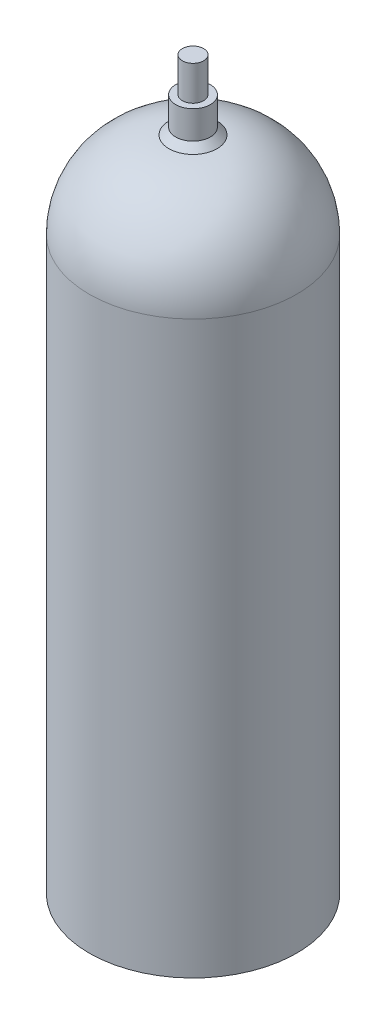
ISO-10303-21;
HEADER;
FILE_DESCRIPTION(('STEP AP214'),'2;1');
FILE_NAME('part.step','',(''),(''),'','','');
FILE_SCHEMA(('AUTOMOTIVE_DESIGN { 1 0 10303 214 1 1 1 1 }'));
ENDSEC;
DATA;
#1=APPLICATION_CONTEXT('core data for automotive mechanical design processes');
#2=APPLICATION_PROTOCOL_DEFINITION('international standard','automotive_design',2000,#1);
#3=PRODUCT_CONTEXT('',#1,'mechanical');
#4=PRODUCT('Part','Part','',(#3));
#5=PRODUCT_RELATED_PRODUCT_CATEGORY('part','',(#4));
#6=PRODUCT_DEFINITION_FORMATION('','',#4);
#7=PRODUCT_DEFINITION_CONTEXT('part definition',#1,'design');
#8=PRODUCT_DEFINITION('design','',#6,#7);
#9=PRODUCT_DEFINITION_SHAPE('','',#8);
#10=(LENGTH_UNIT() NAMED_UNIT(*) SI_UNIT(.MILLI.,.METRE.));
#11=(NAMED_UNIT(*) PLANE_ANGLE_UNIT() SI_UNIT($,.RADIAN.));
#12=(NAMED_UNIT(*) SI_UNIT($,.STERADIAN.) SOLID_ANGLE_UNIT());
#13=UNCERTAINTY_MEASURE_WITH_UNIT(LENGTH_MEASURE(1.E-05),#10,'distance_accuracy_value','');
#14=(GEOMETRIC_REPRESENTATION_CONTEXT(3) GLOBAL_UNCERTAINTY_ASSIGNED_CONTEXT((#13)) GLOBAL_UNIT_ASSIGNED_CONTEXT((#10,
#11,#12)) REPRESENTATION_CONTEXT('',''));
#15=CARTESIAN_POINT('',(0.,0.,0.));
#16=DIRECTION('',(0.,0.,1.));
#17=DIRECTION('',(1.,0.,0.));
#18=AXIS2_PLACEMENT_3D('',#15,#16,#17);
#19=CARTESIAN_POINT('',(0.,337.108439077539,0.));
#20=DIRECTION('',(0.,1.,0.));
#21=DIRECTION('',(0.,0.,1.));
#22=AXIS2_PLACEMENT_3D('',#19,#20,#21);
#23=CYLINDRICAL_SURFACE('',#22,6.34999999999998);
#24=CARTESIAN_POINT('',(0.,225.369026297821,0.));
#25=DIRECTION('',(0.,-1.,0.));
#26=DIRECTION('',(0.,0.,-1.));
#27=AXIS2_PLACEMENT_3D('',#24,#25,#26);
#28=CIRCLE('',#27,6.34999999999998);
#29=CARTESIAN_POINT('',(0.,225.369026297821,-6.34999999999998));
#30=VERTEX_POINT('',#29);
#31=EDGE_CURVE('E54',#30,#30,#28,.F.);
#32=ORIENTED_EDGE('',*,*,#31,.T.);
#33=EDGE_LOOP('',(#32));
#34=FACE_BOUND('',#33,.T.);
#35=CARTESIAN_POINT('',(0.,235.689026297821,0.));
#36=DIRECTION('',(0.,1.,0.));
#37=DIRECTION('',(0.,0.,1.));
#38=AXIS2_PLACEMENT_3D('',#35,#36,#37);
#39=CIRCLE('',#38,6.34999999999998);
#40=CARTESIAN_POINT('',(0.,235.689026297821,6.34999999999998));
#41=VERTEX_POINT('',#40);
#42=EDGE_CURVE('E70',#41,#41,#39,.T.);
#43=ORIENTED_EDGE('',*,*,#42,.F.);
#44=EDGE_LOOP('',(#43));
#45=FACE_BOUND('',#44,.T.);
#46=ADVANCED_FACE('F45',(#34,#45),#23,.T.);
#47=CARTESIAN_POINT('',(38.1,-18.3109737021787,0.));
#48=DIRECTION('',(0.,1.,0.));
#49=DIRECTION('',(0.,0.,1.));
#50=AXIS2_PLACEMENT_3D('',#47,#48,#49);
#51=PLANE('',#50);
#52=CARTESIAN_POINT('',(0.,-18.3109737021788,0.));
#53=DIRECTION('',(0.,1.,0.));
#54=DIRECTION('',(0.,0.,1.));
#55=AXIS2_PLACEMENT_3D('',#52,#53,#54);
#56=CIRCLE('',#55,38.1);
#57=CARTESIAN_POINT('',(0.,-18.3109737021788,38.1));
#58=VERTEX_POINT('',#57);
#59=EDGE_CURVE('E59',#58,#58,#56,.T.);
#60=ORIENTED_EDGE('',*,*,#59,.F.);
#61=EDGE_LOOP('',(#60));
#62=FACE_BOUND('',#61,.T.);
#63=ADVANCED_FACE('F93',(#62),#51,.F.);
#64=CARTESIAN_POINT('',(0.,337.108439077539,0.));
#65=DIRECTION('',(0.,1.,0.));
#66=DIRECTION('',(0.,0.,1.));
#67=AXIS2_PLACEMENT_3D('',#64,#65,#66);
#68=CYLINDRICAL_SURFACE('',#67,38.1);
#69=CARTESIAN_POINT('',(0.,191.239026297821,0.));
#70=DIRECTION('',(0.,1.,0.));
#71=DIRECTION('',(0.,0.,1.));
#72=AXIS2_PLACEMENT_3D('',#69,#70,#71);
#73=CIRCLE('',#72,38.1);
#74=CARTESIAN_POINT('',(0.,191.239026297821,38.1));
#75=VERTEX_POINT('',#74);
#76=EDGE_CURVE('E64',#75,#75,#73,.T.);
#77=ORIENTED_EDGE('',*,*,#76,.F.);
#78=EDGE_LOOP('',(#77));
#79=FACE_BOUND('',#78,.T.);
#80=ORIENTED_EDGE('',*,*,#59,.T.);
#81=EDGE_LOOP('',(#80));
#82=FACE_BOUND('',#81,.T.);
#83=ADVANCED_FACE('F98',(#79,#82),#68,.T.);
#84=CARTESIAN_POINT('',(0.,191.239026297821,0.));
#85=DIRECTION('',(0.,1.,0.));
#86=DIRECTION('',(0.,0.,1.));
#87=AXIS2_PLACEMENT_3D('',#84,#85,#86);
#88=DEGENERATE_TOROIDAL_SURFACE('',#87,6.34999999999998,31.75,.T.);
#89=CARTESIAN_POINT('',(0.,222.892275850115,0.));
#90=DIRECTION('',(0.,-1.,0.));
#91=DIRECTION('',(0.,0.,-1.));
#92=AXIS2_PLACEMENT_3D('',#89,#90,#91);
#93=CIRCLE('',#92,8.82675044770617);
#94=CARTESIAN_POINT('',(0.,222.892275850115,-8.82675044770617));
#95=VERTEX_POINT('',#94);
#96=EDGE_CURVE('E10',#95,#95,#93,.T.);
#97=ORIENTED_EDGE('',*,*,#96,.T.);
#98=EDGE_LOOP('',(#97));
#99=FACE_BOUND('',#98,.T.);
#100=ORIENTED_EDGE('',*,*,#76,.T.);
#101=EDGE_LOOP('',(#100));
#102=FACE_BOUND('',#101,.T.);
#103=ADVANCED_FACE('F103',(#99,#102),#88,.T.);
#104=CARTESIAN_POINT('',(0.,225.369026297821,0.));
#105=DIRECTION('',(0.,-1.,0.));
#106=DIRECTION('',(0.,0.,-1.));
#107=AXIS2_PLACEMENT_3D('',#104,#105,#106);
#108=CONICAL_SURFACE('',#107,6.34999999999998,0.785398163397446);
#109=ORIENTED_EDGE('',*,*,#96,.F.);
#110=EDGE_LOOP('',(#109));
#111=FACE_BOUND('',#110,.T.);
#112=ORIENTED_EDGE('',*,*,#31,.F.);
#113=EDGE_LOOP('',(#112));
#114=FACE_BOUND('',#113,.T.);
#115=ADVANCED_FACE('F48',(#111,#114),#108,.T.);
#116=CARTESIAN_POINT('',(0.,235.689026297821,0.));
#117=DIRECTION('',(0.,1.,0.));
#118=DIRECTION('',(0.,0.,1.));
#119=AXIS2_PLACEMENT_3D('',#116,#117,#118);
#120=PLANE('',#119);
#121=CARTESIAN_POINT('',(0.,235.689026297821,0.));
#122=DIRECTION('',(0.,1.,0.));
#123=DIRECTION('',(0.,0.,1.));
#124=AXIS2_PLACEMENT_3D('',#121,#122,#123);
#125=CIRCLE('',#124,3.9020290933722);
#126=CARTESIAN_POINT('',(0.,235.689026297821,3.9020290933722));
#127=VERTEX_POINT('',#126);
#128=EDGE_CURVE('E74',#127,#127,#125,.T.);
#129=ORIENTED_EDGE('',*,*,#128,.F.);
#130=EDGE_LOOP('',(#129));
#131=FACE_BOUND('',#130,.T.);
#132=ORIENTED_EDGE('',*,*,#42,.T.);
#133=EDGE_LOOP('',(#132));
#134=FACE_BOUND('',#133,.T.);
#135=ADVANCED_FACE('F86',(#131,#134),#120,.T.);
#136=CARTESIAN_POINT('',(0.,235.689026297821,0.));
#137=DIRECTION('',(0.,1.,0.));
#138=DIRECTION('',(0.,0.,1.));
#139=AXIS2_PLACEMENT_3D('',#136,#137,#138);
#140=CYLINDRICAL_SURFACE('',#139,3.9020290933722);
#141=ORIENTED_EDGE('',*,*,#128,.T.);
#142=EDGE_LOOP('',(#141));
#143=FACE_BOUND('',#142,.T.);
#144=CARTESIAN_POINT('',(0.,248.389026297821,0.));
#145=DIRECTION('',(0.,1.,0.));
#146=DIRECTION('',(0.,0.,1.));
#147=AXIS2_PLACEMENT_3D('',#144,#145,#146);
#148=CIRCLE('',#147,3.9020290933722);
#149=CARTESIAN_POINT('',(0.,248.389026297821,3.9020290933722));
#150=VERTEX_POINT('',#149);
#151=EDGE_CURVE('E75',#150,#150,#148,.T.);
#152=ORIENTED_EDGE('',*,*,#151,.F.);
#153=EDGE_LOOP('',(#152));
#154=FACE_BOUND('',#153,.T.);
#155=ADVANCED_FACE('F83',(#143,#154),#140,.T.);
#156=CARTESIAN_POINT('',(0.,248.389026297821,0.));
#157=DIRECTION('',(0.,-1.,0.));
#158=DIRECTION('',(0.,0.,-1.));
#159=AXIS2_PLACEMENT_3D('',#156,#157,#158);
#160=PLANE('',#159);
#161=ORIENTED_EDGE('',*,*,#151,.T.);
#162=EDGE_LOOP('',(#161));
#163=FACE_BOUND('',#162,.T.);
#164=ADVANCED_FACE('F102',(#163),#160,.F.);
#165=CLOSED_SHELL('',(#46,#63,#83,#103,#115,#135,#155,#164));
#166=MANIFOLD_SOLID_BREP('B2',#165);
#167=ADVANCED_BREP_SHAPE_REPRESENTATION('',(#18,#166),#14);
#168=SHAPE_DEFINITION_REPRESENTATION(#9,#167);
ENDSEC;
END-ISO-10303-21;
